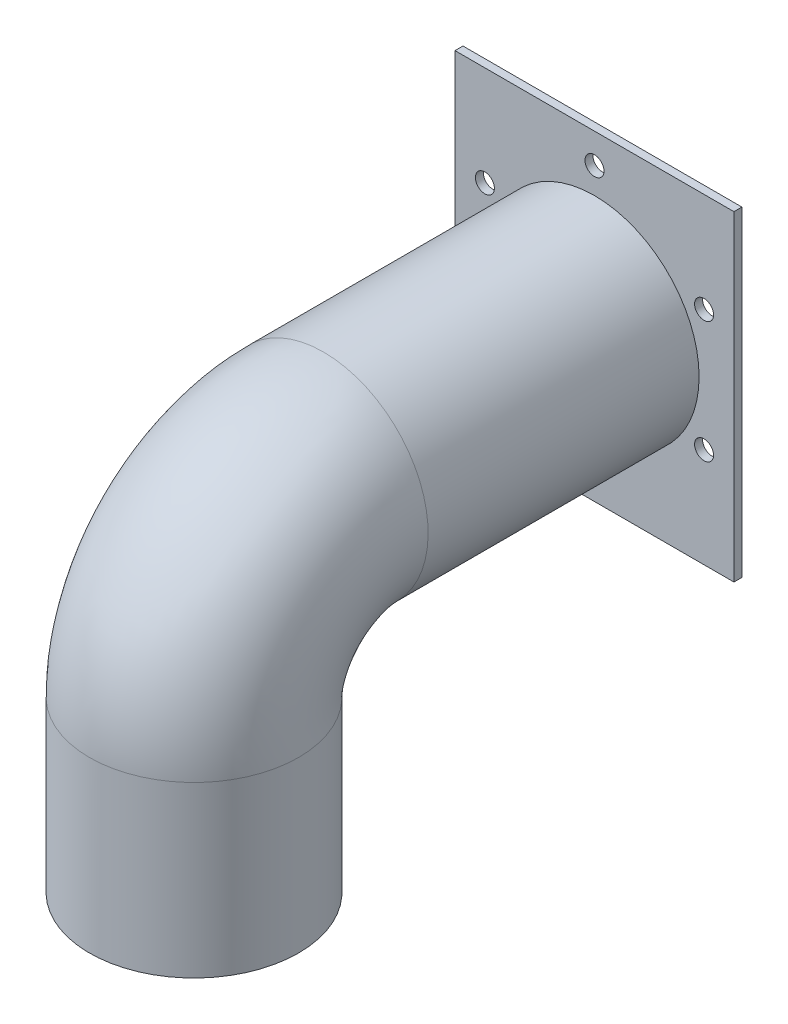
ISO-10303-21;
HEADER;
FILE_DESCRIPTION(('STEP AP214'),'2;1');
FILE_NAME('part.step','',(''),(''),'','','');
FILE_SCHEMA(('AUTOMOTIVE_DESIGN { 1 0 10303 214 1 1 1 1 }'));
ENDSEC;
DATA;
#1=APPLICATION_CONTEXT('core data for automotive mechanical design processes');
#2=APPLICATION_PROTOCOL_DEFINITION('international standard','automotive_design',2000,#1);
#3=PRODUCT_CONTEXT('',#1,'mechanical');
#4=PRODUCT('Part','Part','',(#3));
#5=PRODUCT_RELATED_PRODUCT_CATEGORY('part','',(#4));
#6=PRODUCT_DEFINITION_FORMATION('','',#4);
#7=PRODUCT_DEFINITION_CONTEXT('part definition',#1,'design');
#8=PRODUCT_DEFINITION('design','',#6,#7);
#9=PRODUCT_DEFINITION_SHAPE('','',#8);
#10=(LENGTH_UNIT() NAMED_UNIT(*) SI_UNIT(.MILLI.,.METRE.));
#11=(NAMED_UNIT(*) PLANE_ANGLE_UNIT() SI_UNIT($,.RADIAN.));
#12=(NAMED_UNIT(*) SI_UNIT($,.STERADIAN.) SOLID_ANGLE_UNIT());
#13=UNCERTAINTY_MEASURE_WITH_UNIT(LENGTH_MEASURE(1.E-05),#10,'distance_accuracy_value','');
#14=(GEOMETRIC_REPRESENTATION_CONTEXT(3) GLOBAL_UNCERTAINTY_ASSIGNED_CONTEXT((#13)) GLOBAL_UNIT_ASSIGNED_CONTEXT((#10,
#11,#12)) REPRESENTATION_CONTEXT('',''));
#15=CARTESIAN_POINT('',(0.,0.,0.));
#16=DIRECTION('',(0.,0.,1.));
#17=DIRECTION('',(1.,0.,0.));
#18=AXIS2_PLACEMENT_3D('',#15,#16,#17);
#19=CARTESIAN_POINT('',(0.,0.,10.));
#20=DIRECTION('',(0.,0.,-1.));
#21=DIRECTION('',(-1.,0.,0.));
#22=AXIS2_PLACEMENT_3D('',#19,#20,#21);
#23=CYLINDRICAL_SURFACE('',#22,105.);
#24=CARTESIAN_POINT('',(0.,0.,8.));
#25=DIRECTION('',(0.,0.,1.));
#26=DIRECTION('',(1.,0.,0.));
#27=AXIS2_PLACEMENT_3D('',#24,#25,#26);
#28=CIRCLE('',#27,105.);
#29=CARTESIAN_POINT('',(105.,0.,8.));
#30=VERTEX_POINT('',#29);
#31=EDGE_CURVE('E38',#30,#30,#28,.T.);
#32=ORIENTED_EDGE('',*,*,#31,.T.);
#33=EDGE_LOOP('',(#32));
#34=FACE_BOUND('',#33,.T.);
#35=CARTESIAN_POINT('',(0.,0.,280.));
#36=DIRECTION('',(0.,0.,1.));
#37=DIRECTION('',(1.,0.,0.));
#38=AXIS2_PLACEMENT_3D('',#35,#36,#37);
#39=CIRCLE('',#38,105.);
#40=CARTESIAN_POINT('',(0.,105.,280.));
#41=VERTEX_POINT('',#40);
#42=EDGE_CURVE('E120',#41,#41,#39,.T.);
#43=ORIENTED_EDGE('',*,*,#42,.F.);
#44=EDGE_LOOP('',(#43));
#45=FACE_BOUND('',#44,.T.);
#46=ADVANCED_FACE('F35',(#34,#45),#23,.T.);
#47=CARTESIAN_POINT('',(0.,-300.,410.));
#48=DIRECTION('',(0.,-1.,0.));
#49=DIRECTION('',(1.,0.,0.));
#50=AXIS2_PLACEMENT_3D('',#47,#48,#49);
#51=PLANE('',#50);
#52=CARTESIAN_POINT('',(0.,-300.,410.));
#53=DIRECTION('',(0.,-1.,0.));
#54=DIRECTION('',(1.,0.,0.));
#55=AXIS2_PLACEMENT_3D('',#52,#53,#54);
#56=CIRCLE('',#55,105.);
#57=CARTESIAN_POINT('',(105.,-300.,410.));
#58=VERTEX_POINT('',#57);
#59=EDGE_CURVE('E11',#58,#58,#56,.T.);
#60=ORIENTED_EDGE('',*,*,#59,.T.);
#61=EDGE_LOOP('',(#60));
#62=FACE_BOUND('',#61,.T.);
#63=ADVANCED_FACE('F131',(#62),#51,.T.);
#64=CARTESIAN_POINT('',(0.,-130.,280.));
#65=DIRECTION('',(1.,0.,0.));
#66=DIRECTION('',(0.,0.,-1.));
#67=AXIS2_PLACEMENT_3D('',#64,#65,#66);
#68=TOROIDAL_SURFACE('',#67,130.,105.);
#69=CARTESIAN_POINT('',(0.,-130.,410.));
#70=DIRECTION('',(0.,-1.,0.));
#71=DIRECTION('',(1.,0.,0.));
#72=AXIS2_PLACEMENT_3D('',#69,#70,#71);
#73=CIRCLE('',#72,105.);
#74=CARTESIAN_POINT('',(0.,-130.,515.));
#75=VERTEX_POINT('',#74);
#76=EDGE_CURVE('E43',#75,#75,#73,.T.);
#77=CARTESIAN_POINT('',(0.,-130.,280.));
#78=DIRECTION('',(1.,0.,0.));
#79=DIRECTION('',(0.,0.,-1.));
#80=AXIS2_PLACEMENT_3D('',#77,#78,#79);
#81=CIRCLE('',#80,235.);
#82=EDGE_CURVE('',#41,#75,#81,.T.);
#83=ORIENTED_EDGE('',*,*,#42,.T.);
#84=ORIENTED_EDGE('',*,*,#76,.F.);
#85=ORIENTED_EDGE('',*,*,#82,.T.);
#86=ORIENTED_EDGE('',*,*,#82,.F.);
#87=EDGE_LOOP('',(#83,#85,#84,#86));
#88=FACE_BOUND('',#87,.T.);
#89=ADVANCED_FACE('F128',(#88),#68,.T.);
#90=CARTESIAN_POINT('',(0.,-130.,410.));
#91=DIRECTION('',(0.,-1.,0.));
#92=DIRECTION('',(1.,0.,0.));
#93=AXIS2_PLACEMENT_3D('',#90,#91,#92);
#94=CYLINDRICAL_SURFACE('',#93,105.);
#95=ORIENTED_EDGE('',*,*,#59,.F.);
#96=EDGE_LOOP('',(#95));
#97=FACE_BOUND('',#96,.T.);
#98=ORIENTED_EDGE('',*,*,#76,.T.);
#99=EDGE_LOOP('',(#98));
#100=FACE_BOUND('',#99,.T.);
#101=ADVANCED_FACE('F126',(#97,#100),#94,.T.);
#102=CARTESIAN_POINT('',(-140.,-161.,8.));
#103=DIRECTION('',(-1.,0.,0.));
#104=DIRECTION('',(0.,0.,1.));
#105=AXIS2_PLACEMENT_3D('',#102,#103,#104);
#106=PLANE('',#105);
#107=DIRECTION('',(0.,1.,0.));
#108=VECTOR('',#107,1.);
#109=CARTESIAN_POINT('',(-140.,-161.,0.));
#110=LINE('',#109,#108);
#111=CARTESIAN_POINT('',(-140.,-161.,0.));
#112=VERTEX_POINT('',#111);
#113=CARTESIAN_POINT('',(-140.,161.,0.));
#114=VERTEX_POINT('',#113);
#115=EDGE_CURVE('E108',#112,#114,#110,.T.);
#116=ORIENTED_EDGE('',*,*,#115,.F.);
#117=DIRECTION('',(0.,0.,-1.));
#118=VECTOR('',#117,1.);
#119=CARTESIAN_POINT('',(-140.,-161.,8.));
#120=LINE('',#119,#118);
#121=CARTESIAN_POINT('',(-140.,-161.,8.));
#122=VERTEX_POINT('',#121);
#123=EDGE_CURVE('E54',#122,#112,#120,.T.);
#124=ORIENTED_EDGE('',*,*,#123,.F.);
#125=DIRECTION('',(0.,1.,0.));
#126=VECTOR('',#125,1.);
#127=CARTESIAN_POINT('',(-140.,-161.,8.));
#128=LINE('',#127,#126);
#129=CARTESIAN_POINT('',(-140.,161.,8.));
#130=VERTEX_POINT('',#129);
#131=EDGE_CURVE('E101',#122,#130,#128,.T.);
#132=ORIENTED_EDGE('',*,*,#131,.T.);
#133=DIRECTION('',(0.,0.,-1.));
#134=VECTOR('',#133,1.);
#135=CARTESIAN_POINT('',(-140.,161.,8.));
#136=LINE('',#135,#134);
#137=EDGE_CURVE('E79',#130,#114,#136,.T.);
#138=ORIENTED_EDGE('',*,*,#137,.T.);
#139=EDGE_LOOP('',(#116,#124,#132,#138));
#140=FACE_BOUND('',#139,.T.);
#141=ADVANCED_FACE('F141',(#140),#106,.T.);
#142=CARTESIAN_POINT('',(140.,-161.,8.));
#143=DIRECTION('',(0.,-1.,0.));
#144=DIRECTION('',(0.,0.,-1.));
#145=AXIS2_PLACEMENT_3D('',#142,#143,#144);
#146=PLANE('',#145);
#147=DIRECTION('',(-1.,0.,0.));
#148=VECTOR('',#147,1.);
#149=CARTESIAN_POINT('',(140.,-161.,0.));
#150=LINE('',#149,#148);
#151=CARTESIAN_POINT('',(140.,-161.,0.));
#152=VERTEX_POINT('',#151);
#153=EDGE_CURVE('E103',#152,#112,#150,.T.);
#154=ORIENTED_EDGE('',*,*,#153,.F.);
#155=DIRECTION('',(0.,0.,-1.));
#156=VECTOR('',#155,1.);
#157=CARTESIAN_POINT('',(140.,-161.,8.));
#158=LINE('',#157,#156);
#159=CARTESIAN_POINT('',(140.,-161.,8.));
#160=VERTEX_POINT('',#159);
#161=EDGE_CURVE('E93',#160,#152,#158,.T.);
#162=ORIENTED_EDGE('',*,*,#161,.F.);
#163=DIRECTION('',(-1.,0.,0.));
#164=VECTOR('',#163,1.);
#165=CARTESIAN_POINT('',(140.,-161.,8.));
#166=LINE('',#165,#164);
#167=EDGE_CURVE('E98',#160,#122,#166,.T.);
#168=ORIENTED_EDGE('',*,*,#167,.T.);
#169=ORIENTED_EDGE('',*,*,#123,.T.);
#170=EDGE_LOOP('',(#154,#162,#168,#169));
#171=FACE_BOUND('',#170,.T.);
#172=ADVANCED_FACE('F149',(#171),#146,.T.);
#173=CARTESIAN_POINT('',(140.,-161.,8.));
#174=DIRECTION('',(1.,0.,0.));
#175=DIRECTION('',(0.,0.,-1.));
#176=AXIS2_PLACEMENT_3D('',#173,#174,#175);
#177=PLANE('',#176);
#178=DIRECTION('',(0.,-1.,0.));
#179=VECTOR('',#178,1.);
#180=CARTESIAN_POINT('',(140.,-161.,0.));
#181=LINE('',#180,#179);
#182=CARTESIAN_POINT('',(140.,161.,0.));
#183=VERTEX_POINT('',#182);
#184=EDGE_CURVE('E91',#183,#152,#181,.T.);
#185=ORIENTED_EDGE('',*,*,#184,.F.);
#186=DIRECTION('',(0.,0.,-1.));
#187=VECTOR('',#186,1.);
#188=CARTESIAN_POINT('',(140.,161.,8.));
#189=LINE('',#188,#187);
#190=CARTESIAN_POINT('',(140.,161.,8.));
#191=VERTEX_POINT('',#190);
#192=EDGE_CURVE('E85',#191,#183,#189,.T.);
#193=ORIENTED_EDGE('',*,*,#192,.F.);
#194=DIRECTION('',(0.,-1.,0.));
#195=VECTOR('',#194,1.);
#196=CARTESIAN_POINT('',(140.,-161.,8.));
#197=LINE('',#196,#195);
#198=EDGE_CURVE('E88',#191,#160,#197,.T.);
#199=ORIENTED_EDGE('',*,*,#198,.T.);
#200=ORIENTED_EDGE('',*,*,#161,.T.);
#201=EDGE_LOOP('',(#185,#193,#199,#200));
#202=FACE_BOUND('',#201,.T.);
#203=ADVANCED_FACE('F87',(#202),#177,.T.);
#204=CARTESIAN_POINT('',(140.,161.,8.));
#205=DIRECTION('',(0.,1.,0.));
#206=DIRECTION('',(0.,0.,1.));
#207=AXIS2_PLACEMENT_3D('',#204,#205,#206);
#208=PLANE('',#207);
#209=DIRECTION('',(1.,0.,0.));
#210=VECTOR('',#209,1.);
#211=CARTESIAN_POINT('',(140.,161.,0.));
#212=LINE('',#211,#210);
#213=EDGE_CURVE('E111',#114,#183,#212,.T.);
#214=ORIENTED_EDGE('',*,*,#213,.F.);
#215=ORIENTED_EDGE('',*,*,#137,.F.);
#216=DIRECTION('',(1.,0.,0.));
#217=VECTOR('',#216,1.);
#218=CARTESIAN_POINT('',(140.,161.,8.));
#219=LINE('',#218,#217);
#220=EDGE_CURVE('E97',#130,#191,#219,.T.);
#221=ORIENTED_EDGE('',*,*,#220,.T.);
#222=ORIENTED_EDGE('',*,*,#192,.T.);
#223=EDGE_LOOP('',(#214,#215,#221,#222));
#224=FACE_BOUND('',#223,.T.);
#225=ADVANCED_FACE('F100',(#224),#208,.T.);
#226=CARTESIAN_POINT('',(0.,0.,8.));
#227=DIRECTION('',(0.,0.,1.));
#228=DIRECTION('',(1.,0.,0.));
#229=AXIS2_PLACEMENT_3D('',#226,#227,#228);
#230=PLANE('',#229);
#231=CARTESIAN_POINT('',(110.,61.,8.));
#232=DIRECTION('',(0.,0.,1.));
#233=DIRECTION('',(1.,0.,0.));
#234=AXIS2_PLACEMENT_3D('',#231,#232,#233);
#235=CIRCLE('',#234,9.52500000000001);
#236=CARTESIAN_POINT('',(119.525,61.,8.));
#237=VERTEX_POINT('',#236);
#238=EDGE_CURVE('E271',#237,#237,#235,.T.);
#239=ORIENTED_EDGE('',*,*,#238,.F.);
#240=EDGE_LOOP('',(#239));
#241=FACE_BOUND('',#240,.T.);
#242=CARTESIAN_POINT('',(-110.,61.,8.));
#243=DIRECTION('',(0.,0.,1.));
#244=DIRECTION('',(1.,0.,0.));
#245=AXIS2_PLACEMENT_3D('',#242,#243,#244);
#246=CIRCLE('',#245,9.52500000000001);
#247=CARTESIAN_POINT('',(-100.475,61.,8.));
#248=VERTEX_POINT('',#247);
#249=EDGE_CURVE('E287',#248,#248,#246,.T.);
#250=ORIENTED_EDGE('',*,*,#249,.F.);
#251=EDGE_LOOP('',(#250));
#252=FACE_BOUND('',#251,.T.);
#253=CARTESIAN_POINT('',(-110.,-61.,8.));
#254=DIRECTION('',(0.,0.,1.));
#255=DIRECTION('',(1.,0.,0.));
#256=AXIS2_PLACEMENT_3D('',#253,#254,#255);
#257=CIRCLE('',#256,9.525);
#258=CARTESIAN_POINT('',(-100.475,-61.,8.));
#259=VERTEX_POINT('',#258);
#260=EDGE_CURVE('E284',#259,#259,#257,.T.);
#261=ORIENTED_EDGE('',*,*,#260,.F.);
#262=EDGE_LOOP('',(#261));
#263=FACE_BOUND('',#262,.T.);
#264=CARTESIAN_POINT('',(110.,-61.,8.));
#265=DIRECTION('',(0.,0.,1.));
#266=DIRECTION('',(1.,0.,0.));
#267=AXIS2_PLACEMENT_3D('',#264,#265,#266);
#268=CIRCLE('',#267,9.525);
#269=CARTESIAN_POINT('',(119.525,-61.,8.));
#270=VERTEX_POINT('',#269);
#271=EDGE_CURVE('E275',#270,#270,#268,.T.);
#272=ORIENTED_EDGE('',*,*,#271,.F.);
#273=EDGE_LOOP('',(#272));
#274=FACE_BOUND('',#273,.T.);
#275=CARTESIAN_POINT('',(0.,-131.,8.));
#276=DIRECTION('',(0.,0.,1.));
#277=DIRECTION('',(1.,0.,0.));
#278=AXIS2_PLACEMENT_3D('',#275,#276,#277);
#279=CIRCLE('',#278,9.525);
#280=CARTESIAN_POINT('',(9.52499999999994,-131.,8.));
#281=VERTEX_POINT('',#280);
#282=EDGE_CURVE('E272',#281,#281,#279,.T.);
#283=ORIENTED_EDGE('',*,*,#282,.F.);
#284=EDGE_LOOP('',(#283));
#285=FACE_BOUND('',#284,.T.);
#286=CARTESIAN_POINT('',(0.,131.,8.));
#287=DIRECTION('',(0.,0.,1.));
#288=DIRECTION('',(1.,0.,0.));
#289=AXIS2_PLACEMENT_3D('',#286,#287,#288);
#290=CIRCLE('',#289,9.525);
#291=CARTESIAN_POINT('',(9.52499999999999,131.,8.));
#292=VERTEX_POINT('',#291);
#293=EDGE_CURVE('E112',#292,#292,#290,.T.);
#294=ORIENTED_EDGE('',*,*,#293,.F.);
#295=EDGE_LOOP('',(#294));
#296=FACE_BOUND('',#295,.T.);
#297=ORIENTED_EDGE('',*,*,#31,.F.);
#298=EDGE_LOOP('',(#297));
#299=FACE_BOUND('',#298,.T.);
#300=ORIENTED_EDGE('',*,*,#131,.F.);
#301=ORIENTED_EDGE('',*,*,#167,.F.);
#302=ORIENTED_EDGE('',*,*,#198,.F.);
#303=ORIENTED_EDGE('',*,*,#220,.F.);
#304=EDGE_LOOP('',(#300,#301,#302,#303));
#305=FACE_BOUND('',#304,.T.);
#306=ADVANCED_FACE('F96',(#241,#252,#263,#274,#285,#296,#299,#305),#230,.T.);
#307=CARTESIAN_POINT('',(0.,0.,0.));
#308=DIRECTION('',(0.,0.,1.));
#309=DIRECTION('',(1.,0.,0.));
#310=AXIS2_PLACEMENT_3D('',#307,#308,#309);
#311=PLANE('',#310);
#312=CARTESIAN_POINT('',(110.,61.,0.));
#313=DIRECTION('',(0.,0.,-1.));
#314=DIRECTION('',(-1.,0.,0.));
#315=AXIS2_PLACEMENT_3D('',#312,#313,#314);
#316=CIRCLE('',#315,9.52500000000001);
#317=CARTESIAN_POINT('',(100.475,61.,0.));
#318=VERTEX_POINT('',#317);
#319=EDGE_CURVE('E167',#318,#318,#316,.T.);
#320=ORIENTED_EDGE('',*,*,#319,.F.);
#321=EDGE_LOOP('',(#320));
#322=FACE_BOUND('',#321,.T.);
#323=CARTESIAN_POINT('',(-110.,61.,0.));
#324=DIRECTION('',(0.,0.,-1.));
#325=DIRECTION('',(1.,0.,0.));
#326=AXIS2_PLACEMENT_3D('',#323,#324,#325);
#327=CIRCLE('',#326,9.52500000000001);
#328=CARTESIAN_POINT('',(-100.475,61.,0.));
#329=VERTEX_POINT('',#328);
#330=EDGE_CURVE('E171',#329,#329,#327,.T.);
#331=ORIENTED_EDGE('',*,*,#330,.F.);
#332=EDGE_LOOP('',(#331));
#333=FACE_BOUND('',#332,.T.);
#334=CARTESIAN_POINT('',(-110.,-61.,0.));
#335=DIRECTION('',(0.,0.,-1.));
#336=DIRECTION('',(-1.,0.,0.));
#337=AXIS2_PLACEMENT_3D('',#334,#335,#336);
#338=CIRCLE('',#337,9.525);
#339=CARTESIAN_POINT('',(-119.525,-61.,0.));
#340=VERTEX_POINT('',#339);
#341=EDGE_CURVE('E175',#340,#340,#338,.T.);
#342=ORIENTED_EDGE('',*,*,#341,.F.);
#343=EDGE_LOOP('',(#342));
#344=FACE_BOUND('',#343,.T.);
#345=CARTESIAN_POINT('',(110.,-61.,0.));
#346=DIRECTION('',(0.,0.,-1.));
#347=DIRECTION('',(1.,0.,0.));
#348=AXIS2_PLACEMENT_3D('',#345,#346,#347);
#349=CIRCLE('',#348,9.525);
#350=CARTESIAN_POINT('',(119.525,-61.,0.));
#351=VERTEX_POINT('',#350);
#352=EDGE_CURVE('E179',#351,#351,#349,.T.);
#353=ORIENTED_EDGE('',*,*,#352,.F.);
#354=EDGE_LOOP('',(#353));
#355=FACE_BOUND('',#354,.T.);
#356=CARTESIAN_POINT('',(0.,-131.,0.));
#357=DIRECTION('',(0.,0.,-1.));
#358=DIRECTION('',(1.,0.,0.));
#359=AXIS2_PLACEMENT_3D('',#356,#357,#358);
#360=CIRCLE('',#359,9.525);
#361=CARTESIAN_POINT('',(9.52499999999994,-131.,0.));
#362=VERTEX_POINT('',#361);
#363=EDGE_CURVE('E183',#362,#362,#360,.T.);
#364=ORIENTED_EDGE('',*,*,#363,.F.);
#365=EDGE_LOOP('',(#364));
#366=FACE_BOUND('',#365,.T.);
#367=CARTESIAN_POINT('',(0.,131.,0.));
#368=DIRECTION('',(0.,0.,-1.));
#369=DIRECTION('',(-1.,0.,0.));
#370=AXIS2_PLACEMENT_3D('',#367,#368,#369);
#371=CIRCLE('',#370,9.525);
#372=CARTESIAN_POINT('',(-9.525,131.,0.));
#373=VERTEX_POINT('',#372);
#374=EDGE_CURVE('E187',#373,#373,#371,.T.);
#375=ORIENTED_EDGE('',*,*,#374,.F.);
#376=EDGE_LOOP('',(#375));
#377=FACE_BOUND('',#376,.T.);
#378=ORIENTED_EDGE('',*,*,#115,.T.);
#379=ORIENTED_EDGE('',*,*,#213,.T.);
#380=ORIENTED_EDGE('',*,*,#184,.T.);
#381=ORIENTED_EDGE('',*,*,#153,.T.);
#382=EDGE_LOOP('',(#378,#379,#380,#381));
#383=FACE_BOUND('',#382,.T.);
#384=ADVANCED_FACE('F151',(#322,#333,#344,#355,#366,#377,#383),#311,.F.);
#385=CARTESIAN_POINT('',(0.,131.,10.));
#386=DIRECTION('',(0.,0.,-1.));
#387=DIRECTION('',(-1.,0.,0.));
#388=AXIS2_PLACEMENT_3D('',#385,#386,#387);
#389=CYLINDRICAL_SURFACE('',#388,9.525);
#390=ORIENTED_EDGE('',*,*,#293,.T.);
#391=EDGE_LOOP('',(#390));
#392=FACE_BOUND('',#391,.T.);
#393=ORIENTED_EDGE('',*,*,#374,.T.);
#394=EDGE_LOOP('',(#393));
#395=FACE_BOUND('',#394,.T.);
#396=ADVANCED_FACE('F153',(#392,#395),#389,.F.);
#397=CARTESIAN_POINT('',(0.,-131.,10.));
#398=DIRECTION('',(0.,0.,-1.));
#399=DIRECTION('',(-1.,0.,0.));
#400=AXIS2_PLACEMENT_3D('',#397,#398,#399);
#401=CYLINDRICAL_SURFACE('',#400,9.525);
#402=ORIENTED_EDGE('',*,*,#282,.T.);
#403=EDGE_LOOP('',(#402));
#404=FACE_BOUND('',#403,.T.);
#405=ORIENTED_EDGE('',*,*,#363,.T.);
#406=EDGE_LOOP('',(#405));
#407=FACE_BOUND('',#406,.T.);
#408=ADVANCED_FACE('F159',(#404,#407),#401,.F.);
#409=CARTESIAN_POINT('',(110.,-61.,10.));
#410=DIRECTION('',(0.,0.,-1.));
#411=DIRECTION('',(-1.,0.,0.));
#412=AXIS2_PLACEMENT_3D('',#409,#410,#411);
#413=CYLINDRICAL_SURFACE('',#412,9.525);
#414=ORIENTED_EDGE('',*,*,#271,.T.);
#415=EDGE_LOOP('',(#414));
#416=FACE_BOUND('',#415,.T.);
#417=ORIENTED_EDGE('',*,*,#352,.T.);
#418=EDGE_LOOP('',(#417));
#419=FACE_BOUND('',#418,.T.);
#420=ADVANCED_FACE('F224',(#416,#419),#413,.F.);
#421=CARTESIAN_POINT('',(-110.,-61.,10.));
#422=DIRECTION('',(0.,0.,-1.));
#423=DIRECTION('',(-1.,0.,0.));
#424=AXIS2_PLACEMENT_3D('',#421,#422,#423);
#425=CYLINDRICAL_SURFACE('',#424,9.525);
#426=ORIENTED_EDGE('',*,*,#260,.T.);
#427=EDGE_LOOP('',(#426));
#428=FACE_BOUND('',#427,.T.);
#429=ORIENTED_EDGE('',*,*,#341,.T.);
#430=EDGE_LOOP('',(#429));
#431=FACE_BOUND('',#430,.T.);
#432=ADVANCED_FACE('F234',(#428,#431),#425,.F.);
#433=CARTESIAN_POINT('',(-110.,61.,10.));
#434=DIRECTION('',(0.,0.,-1.));
#435=DIRECTION('',(-1.,0.,0.));
#436=AXIS2_PLACEMENT_3D('',#433,#434,#435);
#437=CYLINDRICAL_SURFACE('',#436,9.52500000000001);
#438=ORIENTED_EDGE('',*,*,#249,.T.);
#439=EDGE_LOOP('',(#438));
#440=FACE_BOUND('',#439,.T.);
#441=ORIENTED_EDGE('',*,*,#330,.T.);
#442=EDGE_LOOP('',(#441));
#443=FACE_BOUND('',#442,.T.);
#444=ADVANCED_FACE('F244',(#440,#443),#437,.F.);
#445=CARTESIAN_POINT('',(110.,61.,10.));
#446=DIRECTION('',(0.,0.,-1.));
#447=DIRECTION('',(-1.,0.,0.));
#448=AXIS2_PLACEMENT_3D('',#445,#446,#447);
#449=CYLINDRICAL_SURFACE('',#448,9.52500000000001);
#450=ORIENTED_EDGE('',*,*,#238,.T.);
#451=EDGE_LOOP('',(#450));
#452=FACE_BOUND('',#451,.T.);
#453=ORIENTED_EDGE('',*,*,#319,.T.);
#454=EDGE_LOOP('',(#453));
#455=FACE_BOUND('',#454,.T.);
#456=ADVANCED_FACE('F254',(#452,#455),#449,.F.);
#457=CLOSED_SHELL('',(#46,#63,#89,#101,#141,#172,#203,#225,#306,#384,#396,#408,#420,#432,#444,#456));
#458=MANIFOLD_SOLID_BREP('B2',#457);
#459=ADVANCED_BREP_SHAPE_REPRESENTATION('',(#18,#458),#14);
#460=SHAPE_DEFINITION_REPRESENTATION(#9,#459);
ENDSEC;
END-ISO-10303-21;
